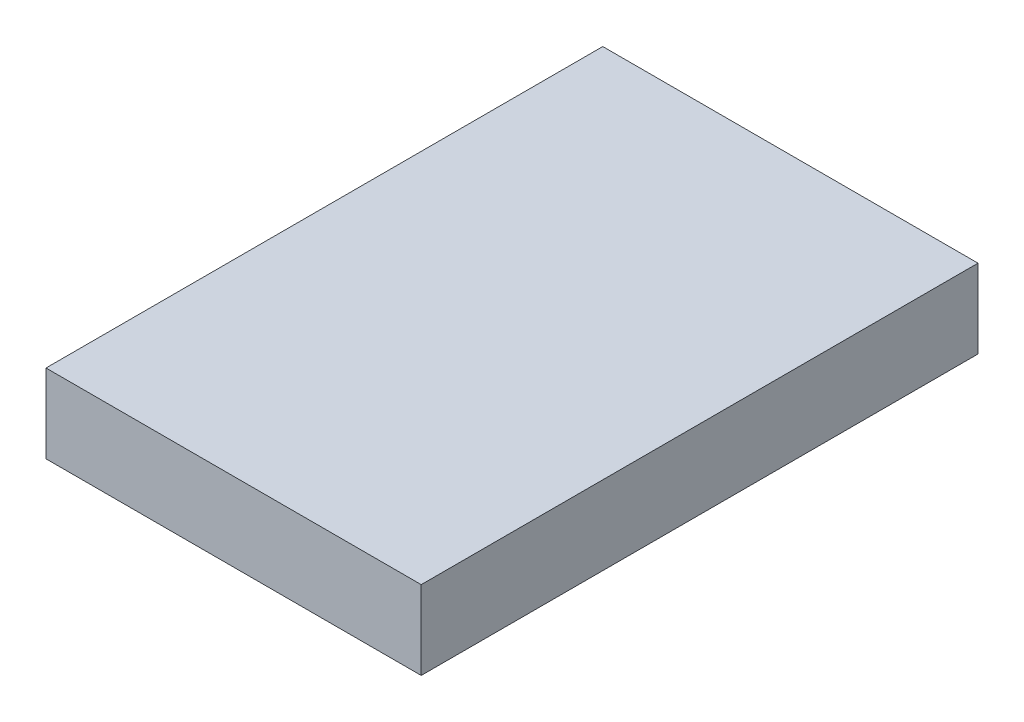
ISO-10303-21;
HEADER;
FILE_DESCRIPTION(('STEP AP214'),'2;1');
FILE_NAME('part.step','',(''),(''),'','','');
FILE_SCHEMA(('AUTOMOTIVE_DESIGN { 1 0 10303 214 1 1 1 1 }'));
ENDSEC;
DATA;
#1=APPLICATION_CONTEXT('core data for automotive mechanical design processes');
#2=APPLICATION_PROTOCOL_DEFINITION('international standard','automotive_design',2000,#1);
#3=PRODUCT_CONTEXT('',#1,'mechanical');
#4=PRODUCT('Part','Part','',(#3));
#5=PRODUCT_RELATED_PRODUCT_CATEGORY('part','',(#4));
#6=PRODUCT_DEFINITION_FORMATION('','',#4);
#7=PRODUCT_DEFINITION_CONTEXT('part definition',#1,'design');
#8=PRODUCT_DEFINITION('design','',#6,#7);
#9=PRODUCT_DEFINITION_SHAPE('','',#8);
#10=(LENGTH_UNIT() NAMED_UNIT(*) SI_UNIT(.MILLI.,.METRE.));
#11=(NAMED_UNIT(*) PLANE_ANGLE_UNIT() SI_UNIT($,.RADIAN.));
#12=(NAMED_UNIT(*) SI_UNIT($,.STERADIAN.) SOLID_ANGLE_UNIT());
#13=UNCERTAINTY_MEASURE_WITH_UNIT(LENGTH_MEASURE(1.E-05),#10,'distance_accuracy_value','');
#14=(GEOMETRIC_REPRESENTATION_CONTEXT(3) GLOBAL_UNCERTAINTY_ASSIGNED_CONTEXT((#13)) GLOBAL_UNIT_ASSIGNED_CONTEXT((#10,
#11,#12)) REPRESENTATION_CONTEXT('',''));
#15=CARTESIAN_POINT('',(0.,0.,0.));
#16=DIRECTION('',(0.,0.,1.));
#17=DIRECTION('',(1.,0.,0.));
#18=AXIS2_PLACEMENT_3D('',#15,#16,#17);
#19=CARTESIAN_POINT('',(39.37,16.51,58.42));
#20=DIRECTION('',(-1.,0.,0.));
#21=DIRECTION('',(0.,0.,1.));
#22=AXIS2_PLACEMENT_3D('',#19,#20,#21);
#23=PLANE('',#22);
#24=DIRECTION('',(0.,0.,-1.));
#25=VECTOR('',#24,1.);
#26=CARTESIAN_POINT('',(39.37,0.,58.42));
#27=LINE('',#26,#25);
#28=CARTESIAN_POINT('',(39.37,0.,58.42));
#29=VERTEX_POINT('',#28);
#30=CARTESIAN_POINT('',(39.37,0.,-58.42));
#31=VERTEX_POINT('',#30);
#32=EDGE_CURVE('E96',#29,#31,#27,.T.);
#33=ORIENTED_EDGE('',*,*,#32,.T.);
#34=DIRECTION('',(0.,-1.,0.));
#35=VECTOR('',#34,1.);
#36=CARTESIAN_POINT('',(39.37,16.51,-58.42));
#37=LINE('',#36,#35);
#38=CARTESIAN_POINT('',(39.37,16.51,-58.42));
#39=VERTEX_POINT('',#38);
#40=EDGE_CURVE('E11',#39,#31,#37,.T.);
#41=ORIENTED_EDGE('',*,*,#40,.F.);
#42=DIRECTION('',(0.,0.,-1.));
#43=VECTOR('',#42,1.);
#44=CARTESIAN_POINT('',(39.37,16.51,58.42));
#45=LINE('',#44,#43);
#46=CARTESIAN_POINT('',(39.37,16.51,58.42));
#47=VERTEX_POINT('',#46);
#48=EDGE_CURVE('E84',#47,#39,#45,.T.);
#49=ORIENTED_EDGE('',*,*,#48,.F.);
#50=DIRECTION('',(0.,-1.,0.));
#51=VECTOR('',#50,1.);
#52=CARTESIAN_POINT('',(39.37,16.51,58.42));
#53=LINE('',#52,#51);
#54=EDGE_CURVE('E92',#47,#29,#53,.T.);
#55=ORIENTED_EDGE('',*,*,#54,.T.);
#56=EDGE_LOOP('',(#33,#41,#49,#55));
#57=FACE_BOUND('',#56,.T.);
#58=ADVANCED_FACE('F33',(#57),#23,.F.);
#59=CARTESIAN_POINT('',(-39.37,16.51,-58.42));
#60=DIRECTION('',(0.,0.,1.));
#61=DIRECTION('',(1.,0.,0.));
#62=AXIS2_PLACEMENT_3D('',#59,#60,#61);
#63=PLANE('',#62);
#64=DIRECTION('',(-1.,0.,0.));
#65=VECTOR('',#64,1.);
#66=CARTESIAN_POINT('',(-39.37,0.,-58.42));
#67=LINE('',#66,#65);
#68=CARTESIAN_POINT('',(-39.37,0.,-58.42));
#69=VERTEX_POINT('',#68);
#70=EDGE_CURVE('E88',#31,#69,#67,.T.);
#71=ORIENTED_EDGE('',*,*,#70,.T.);
#72=DIRECTION('',(0.,-1.,0.));
#73=VECTOR('',#72,1.);
#74=CARTESIAN_POINT('',(-39.37,16.51,-58.42));
#75=LINE('',#74,#73);
#76=CARTESIAN_POINT('',(-39.37,16.51,-58.42));
#77=VERTEX_POINT('',#76);
#78=EDGE_CURVE('E41',#77,#69,#75,.T.);
#79=ORIENTED_EDGE('',*,*,#78,.F.);
#80=DIRECTION('',(-1.,0.,0.));
#81=VECTOR('',#80,1.);
#82=CARTESIAN_POINT('',(-39.37,16.51,-58.42));
#83=LINE('',#82,#81);
#84=EDGE_CURVE('E79',#39,#77,#83,.T.);
#85=ORIENTED_EDGE('',*,*,#84,.F.);
#86=ORIENTED_EDGE('',*,*,#40,.T.);
#87=EDGE_LOOP('',(#71,#79,#85,#86));
#88=FACE_BOUND('',#87,.T.);
#89=ADVANCED_FACE('F87',(#88),#63,.F.);
#90=CARTESIAN_POINT('',(-39.37,16.51,58.42));
#91=DIRECTION('',(1.,0.,0.));
#92=DIRECTION('',(0.,0.,-1.));
#93=AXIS2_PLACEMENT_3D('',#90,#91,#92);
#94=PLANE('',#93);
#95=DIRECTION('',(0.,0.,1.));
#96=VECTOR('',#95,1.);
#97=CARTESIAN_POINT('',(-39.37,0.,58.42));
#98=LINE('',#97,#96);
#99=CARTESIAN_POINT('',(-39.37,0.,58.42));
#100=VERTEX_POINT('',#99);
#101=EDGE_CURVE('E66',#69,#100,#98,.T.);
#102=ORIENTED_EDGE('',*,*,#101,.T.);
#103=DIRECTION('',(0.,-1.,0.));
#104=VECTOR('',#103,1.);
#105=CARTESIAN_POINT('',(-39.37,16.51,58.42));
#106=LINE('',#105,#104);
#107=CARTESIAN_POINT('',(-39.37,16.51,58.42));
#108=VERTEX_POINT('',#107);
#109=EDGE_CURVE('E89',#108,#100,#106,.T.);
#110=ORIENTED_EDGE('',*,*,#109,.F.);
#111=DIRECTION('',(0.,0.,1.));
#112=VECTOR('',#111,1.);
#113=CARTESIAN_POINT('',(-39.37,16.51,58.42));
#114=LINE('',#113,#112);
#115=EDGE_CURVE('E82',#77,#108,#114,.T.);
#116=ORIENTED_EDGE('',*,*,#115,.F.);
#117=ORIENTED_EDGE('',*,*,#78,.T.);
#118=EDGE_LOOP('',(#102,#110,#116,#117));
#119=FACE_BOUND('',#118,.T.);
#120=ADVANCED_FACE('F90',(#119),#94,.F.);
#121=CARTESIAN_POINT('',(-39.37,16.51,58.42));
#122=DIRECTION('',(0.,0.,-1.));
#123=DIRECTION('',(-1.,0.,0.));
#124=AXIS2_PLACEMENT_3D('',#121,#122,#123);
#125=PLANE('',#124);
#126=DIRECTION('',(1.,0.,0.));
#127=VECTOR('',#126,1.);
#128=CARTESIAN_POINT('',(-39.37,0.,58.42));
#129=LINE('',#128,#127);
#130=EDGE_CURVE('E72',#100,#29,#129,.T.);
#131=ORIENTED_EDGE('',*,*,#130,.T.);
#132=ORIENTED_EDGE('',*,*,#54,.F.);
#133=DIRECTION('',(1.,0.,0.));
#134=VECTOR('',#133,1.);
#135=CARTESIAN_POINT('',(-39.37,16.51,58.42));
#136=LINE('',#135,#134);
#137=EDGE_CURVE('E49',#108,#47,#136,.T.);
#138=ORIENTED_EDGE('',*,*,#137,.F.);
#139=ORIENTED_EDGE('',*,*,#109,.T.);
#140=EDGE_LOOP('',(#131,#132,#138,#139));
#141=FACE_BOUND('',#140,.T.);
#142=ADVANCED_FACE('F103',(#141),#125,.F.);
#143=CARTESIAN_POINT('',(0.,16.51,0.));
#144=DIRECTION('',(0.,-1.,0.));
#145=DIRECTION('',(0.,0.,-1.));
#146=AXIS2_PLACEMENT_3D('',#143,#144,#145);
#147=PLANE('',#146);
#148=ORIENTED_EDGE('',*,*,#48,.T.);
#149=ORIENTED_EDGE('',*,*,#84,.T.);
#150=ORIENTED_EDGE('',*,*,#115,.T.);
#151=ORIENTED_EDGE('',*,*,#137,.T.);
#152=EDGE_LOOP('',(#148,#149,#150,#151));
#153=FACE_BOUND('',#152,.T.);
#154=ADVANCED_FACE('F80',(#153),#147,.F.);
#155=CARTESIAN_POINT('',(0.,0.,0.));
#156=DIRECTION('',(0.,-1.,0.));
#157=DIRECTION('',(0.,0.,-1.));
#158=AXIS2_PLACEMENT_3D('',#155,#156,#157);
#159=PLANE('',#158);
#160=ORIENTED_EDGE('',*,*,#32,.F.);
#161=ORIENTED_EDGE('',*,*,#130,.F.);
#162=ORIENTED_EDGE('',*,*,#101,.F.);
#163=ORIENTED_EDGE('',*,*,#70,.F.);
#164=EDGE_LOOP('',(#160,#161,#162,#163));
#165=FACE_BOUND('',#164,.T.);
#166=ADVANCED_FACE('F106',(#165),#159,.T.);
#167=CLOSED_SHELL('',(#58,#89,#120,#142,#154,#166));
#168=MANIFOLD_SOLID_BREP('B2',#167);
#169=ADVANCED_BREP_SHAPE_REPRESENTATION('',(#18,#168),#14);
#170=SHAPE_DEFINITION_REPRESENTATION(#9,#169);
ENDSEC;
END-ISO-10303-21;
